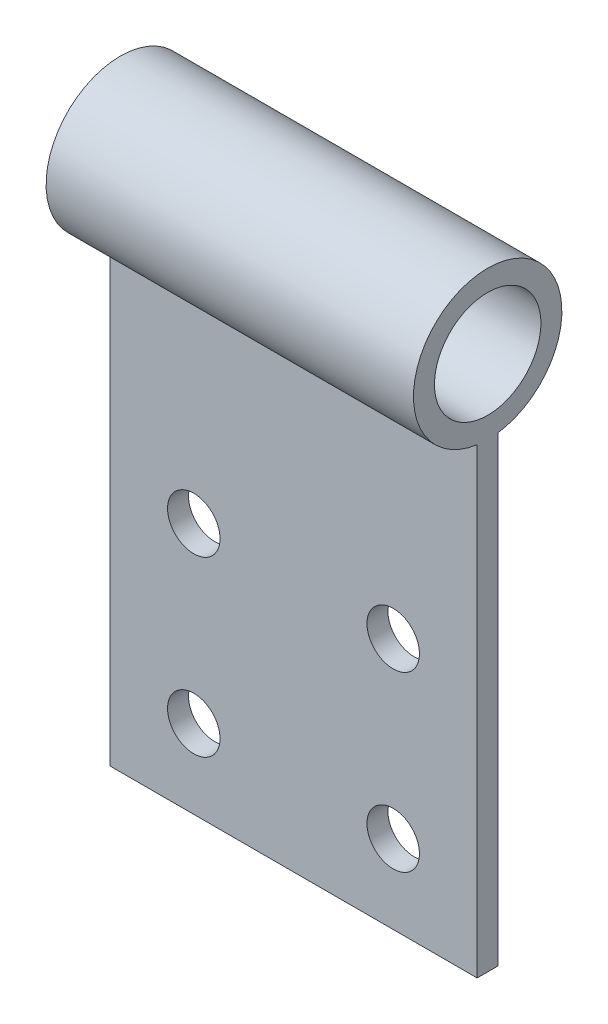
ISO-10303-21;
HEADER;
FILE_DESCRIPTION(('STEP AP214'),'2;1');
FILE_NAME('part.step','',(''),(''),'','','');
FILE_SCHEMA(('AUTOMOTIVE_DESIGN { 1 0 10303 214 1 1 1 1 }'));
ENDSEC;
DATA;
#1=APPLICATION_CONTEXT('core data for automotive mechanical design processes');
#2=APPLICATION_PROTOCOL_DEFINITION('international standard','automotive_design',2000,#1);
#3=PRODUCT_CONTEXT('',#1,'mechanical');
#4=PRODUCT('Part','Part','',(#3));
#5=PRODUCT_RELATED_PRODUCT_CATEGORY('part','',(#4));
#6=PRODUCT_DEFINITION_FORMATION('','',#4);
#7=PRODUCT_DEFINITION_CONTEXT('part definition',#1,'design');
#8=PRODUCT_DEFINITION('design','',#6,#7);
#9=PRODUCT_DEFINITION_SHAPE('','',#8);
#10=(LENGTH_UNIT() NAMED_UNIT(*) SI_UNIT(.MILLI.,.METRE.));
#11=(NAMED_UNIT(*) PLANE_ANGLE_UNIT() SI_UNIT($,.RADIAN.));
#12=(NAMED_UNIT(*) SI_UNIT($,.STERADIAN.) SOLID_ANGLE_UNIT());
#13=UNCERTAINTY_MEASURE_WITH_UNIT(LENGTH_MEASURE(1.E-05),#10,'distance_accuracy_value','');
#14=(GEOMETRIC_REPRESENTATION_CONTEXT(3) GLOBAL_UNCERTAINTY_ASSIGNED_CONTEXT((#13)) GLOBAL_UNIT_ASSIGNED_CONTEXT((#10,
#11,#12)) REPRESENTATION_CONTEXT('',''));
#15=CARTESIAN_POINT('',(0.,0.,0.));
#16=DIRECTION('',(0.,0.,1.));
#17=DIRECTION('',(1.,0.,0.));
#18=AXIS2_PLACEMENT_3D('',#15,#16,#17);
#19=CARTESIAN_POINT('',(0.,0.,2.));
#20=DIRECTION('',(1.,0.,0.));
#21=DIRECTION('',(0.,0.,-1.));
#22=AXIS2_PLACEMENT_3D('',#19,#20,#21);
#23=PLANE('',#22);
#24=DIRECTION('',(0.,-1.,0.));
#25=VECTOR('',#24,1.);
#26=CARTESIAN_POINT('',(0.,0.,0.));
#27=LINE('',#26,#25);
#28=CARTESIAN_POINT('',(0.,44.,0.));
#29=VERTEX_POINT('',#28);
#30=CARTESIAN_POINT('',(0.,0.,0.));
#31=VERTEX_POINT('',#30);
#32=EDGE_CURVE('E128',#29,#31,#27,.T.);
#33=ORIENTED_EDGE('',*,*,#32,.T.);
#34=DIRECTION('',(0.,0.,-1.));
#35=VECTOR('',#34,1.);
#36=CARTESIAN_POINT('',(0.,0.,2.));
#37=LINE('',#36,#35);
#38=CARTESIAN_POINT('',(0.,0.,2.));
#39=VERTEX_POINT('',#38);
#40=EDGE_CURVE('E11',#39,#31,#37,.T.);
#41=ORIENTED_EDGE('',*,*,#40,.F.);
#42=DIRECTION('',(0.,-1.,0.));
#43=VECTOR('',#42,1.);
#44=CARTESIAN_POINT('',(0.,0.,2.));
#45=LINE('',#44,#43);
#46=CARTESIAN_POINT('',(0.,44.,2.));
#47=VERTEX_POINT('',#46);
#48=EDGE_CURVE('E77',#47,#39,#45,.T.);
#49=ORIENTED_EDGE('',*,*,#48,.F.);
#50=CARTESIAN_POINT('',(0.,51.,1.));
#51=DIRECTION('',(-1.,0.,0.));
#52=DIRECTION('',(0.,0.,-1.));
#53=AXIS2_PLACEMENT_3D('',#50,#51,#52);
#54=CIRCLE('',#53,7.07106781186547);
#55=EDGE_CURVE('E82',#47,#29,#54,.T.);
#56=ORIENTED_EDGE('',*,*,#55,.T.);
#57=EDGE_LOOP('',(#33,#41,#49,#56));
#58=FACE_BOUND('',#57,.T.);
#59=CARTESIAN_POINT('',(0.,51.,1.));
#60=DIRECTION('',(-1.,0.,0.));
#61=DIRECTION('',(0.,0.,1.));
#62=AXIS2_PLACEMENT_3D('',#59,#60,#61);
#63=CIRCLE('',#62,5.07106781186548);
#64=CARTESIAN_POINT('',(0.,51.,6.07106781186548));
#65=VERTEX_POINT('',#64);
#66=EDGE_CURVE('E95',#65,#65,#63,.T.);
#67=ORIENTED_EDGE('',*,*,#66,.F.);
#68=EDGE_LOOP('',(#67));
#69=FACE_BOUND('',#68,.T.);
#70=ADVANCED_FACE('F33',(#58,#69),#23,.F.);
#71=CARTESIAN_POINT('',(0.,0.,2.));
#72=DIRECTION('',(0.,1.,0.));
#73=DIRECTION('',(0.,0.,1.));
#74=AXIS2_PLACEMENT_3D('',#71,#72,#73);
#75=PLANE('',#74);
#76=DIRECTION('',(1.,0.,0.));
#77=VECTOR('',#76,1.);
#78=CARTESIAN_POINT('',(0.,0.,0.));
#79=LINE('',#78,#77);
#80=CARTESIAN_POINT('',(35.,0.,0.));
#81=VERTEX_POINT('',#80);
#82=EDGE_CURVE('E60',#31,#81,#79,.T.);
#83=ORIENTED_EDGE('',*,*,#82,.T.);
#84=DIRECTION('',(0.,0.,-1.));
#85=VECTOR('',#84,1.);
#86=CARTESIAN_POINT('',(35.,0.,2.));
#87=LINE('',#86,#85);
#88=CARTESIAN_POINT('',(35.,0.,2.));
#89=VERTEX_POINT('',#88);
#90=EDGE_CURVE('E41',#89,#81,#87,.T.);
#91=ORIENTED_EDGE('',*,*,#90,.F.);
#92=DIRECTION('',(1.,0.,0.));
#93=VECTOR('',#92,1.);
#94=CARTESIAN_POINT('',(0.,0.,2.));
#95=LINE('',#94,#93);
#96=EDGE_CURVE('E49',#39,#89,#95,.T.);
#97=ORIENTED_EDGE('',*,*,#96,.F.);
#98=ORIENTED_EDGE('',*,*,#40,.T.);
#99=EDGE_LOOP('',(#83,#91,#97,#98));
#100=FACE_BOUND('',#99,.T.);
#101=ADVANCED_FACE('F156',(#100),#75,.F.);
#102=CARTESIAN_POINT('',(35.,0.,2.));
#103=DIRECTION('',(-1.,0.,0.));
#104=DIRECTION('',(0.,0.,1.));
#105=AXIS2_PLACEMENT_3D('',#102,#103,#104);
#106=PLANE('',#105);
#107=DIRECTION('',(0.,1.,0.));
#108=VECTOR('',#107,1.);
#109=CARTESIAN_POINT('',(35.,0.,0.));
#110=LINE('',#109,#108);
#111=CARTESIAN_POINT('',(35.,44.,0.));
#112=VERTEX_POINT('',#111);
#113=EDGE_CURVE('E67',#81,#112,#110,.T.);
#114=ORIENTED_EDGE('',*,*,#113,.T.);
#115=CARTESIAN_POINT('',(35.,51.,1.));
#116=DIRECTION('',(-1.,0.,0.));
#117=DIRECTION('',(0.,0.,1.));
#118=AXIS2_PLACEMENT_3D('',#115,#116,#117);
#119=CIRCLE('',#118,7.07106781186547);
#120=CARTESIAN_POINT('',(35.,44.,2.));
#121=VERTEX_POINT('',#120);
#122=EDGE_CURVE('E101',#112,#121,#119,.F.);
#123=ORIENTED_EDGE('',*,*,#122,.T.);
#124=DIRECTION('',(0.,1.,0.));
#125=VECTOR('',#124,1.);
#126=CARTESIAN_POINT('',(35.,0.,2.));
#127=LINE('',#126,#125);
#128=EDGE_CURVE('E88',#89,#121,#127,.T.);
#129=ORIENTED_EDGE('',*,*,#128,.F.);
#130=ORIENTED_EDGE('',*,*,#90,.T.);
#131=EDGE_LOOP('',(#114,#123,#129,#130));
#132=FACE_BOUND('',#131,.T.);
#133=CARTESIAN_POINT('',(35.,51.,1.));
#134=DIRECTION('',(-1.,0.,0.));
#135=DIRECTION('',(0.,0.,1.));
#136=AXIS2_PLACEMENT_3D('',#133,#134,#135);
#137=CIRCLE('',#136,5.07106781186548);
#138=CARTESIAN_POINT('',(35.,51.,6.07106781186548));
#139=VERTEX_POINT('',#138);
#140=EDGE_CURVE('E103',#139,#139,#137,.F.);
#141=ORIENTED_EDGE('',*,*,#140,.F.);
#142=EDGE_LOOP('',(#141));
#143=FACE_BOUND('',#142,.T.);
#144=ADVANCED_FACE('F135',(#132,#143),#106,.F.);
#145=CARTESIAN_POINT('',(0.,0.,2.));
#146=DIRECTION('',(0.,0.,-1.));
#147=DIRECTION('',(-1.,0.,0.));
#148=AXIS2_PLACEMENT_3D('',#145,#146,#147);
#149=PLANE('',#148);
#150=CARTESIAN_POINT('',(27.,7.49999999999999,2.));
#151=DIRECTION('',(0.,0.,-1.));
#152=DIRECTION('',(-1.,0.,0.));
#153=AXIS2_PLACEMENT_3D('',#150,#151,#152);
#154=CIRCLE('',#153,2.5);
#155=CARTESIAN_POINT('',(24.5,7.49999999999999,2.));
#156=VERTEX_POINT('',#155);
#157=EDGE_CURVE('E107',#156,#156,#154,.T.);
#158=ORIENTED_EDGE('',*,*,#157,.T.);
#159=EDGE_LOOP('',(#158));
#160=FACE_BOUND('',#159,.T.);
#161=CARTESIAN_POINT('',(8.,7.49999999999999,2.));
#162=DIRECTION('',(0.,0.,-1.));
#163=DIRECTION('',(-1.,0.,0.));
#164=AXIS2_PLACEMENT_3D('',#161,#162,#163);
#165=CIRCLE('',#164,2.5);
#166=CARTESIAN_POINT('',(5.5,7.49999999999999,2.));
#167=VERTEX_POINT('',#166);
#168=EDGE_CURVE('E113',#167,#167,#165,.T.);
#169=ORIENTED_EDGE('',*,*,#168,.T.);
#170=EDGE_LOOP('',(#169));
#171=FACE_BOUND('',#170,.T.);
#172=CARTESIAN_POINT('',(8.00000000000001,24.,2.));
#173=DIRECTION('',(0.,0.,-1.));
#174=DIRECTION('',(-1.,0.,0.));
#175=AXIS2_PLACEMENT_3D('',#172,#173,#174);
#176=CIRCLE('',#175,2.5);
#177=CARTESIAN_POINT('',(5.50000000000001,24.,2.));
#178=VERTEX_POINT('',#177);
#179=EDGE_CURVE('E119',#178,#178,#176,.T.);
#180=ORIENTED_EDGE('',*,*,#179,.T.);
#181=EDGE_LOOP('',(#180));
#182=FACE_BOUND('',#181,.T.);
#183=CARTESIAN_POINT('',(27.,24.,2.));
#184=DIRECTION('',(0.,0.,-1.));
#185=DIRECTION('',(-1.,0.,0.));
#186=AXIS2_PLACEMENT_3D('',#183,#184,#185);
#187=CIRCLE('',#186,2.5);
#188=CARTESIAN_POINT('',(24.5,24.,2.));
#189=VERTEX_POINT('',#188);
#190=EDGE_CURVE('E125',#189,#189,#187,.T.);
#191=ORIENTED_EDGE('',*,*,#190,.T.);
#192=EDGE_LOOP('',(#191));
#193=FACE_BOUND('',#192,.T.);
#194=ORIENTED_EDGE('',*,*,#48,.T.);
#195=ORIENTED_EDGE('',*,*,#96,.T.);
#196=ORIENTED_EDGE('',*,*,#128,.T.);
#197=DIRECTION('',(-1.,0.,0.));
#198=VECTOR('',#197,1.);
#199=CARTESIAN_POINT('',(57.9469713003926,44.,2.));
#200=LINE('',#199,#198);
#201=EDGE_CURVE('E85',#121,#47,#200,.T.);
#202=ORIENTED_EDGE('',*,*,#201,.T.);
#203=EDGE_LOOP('',(#194,#195,#196,#202));
#204=FACE_BOUND('',#203,.T.);
#205=ADVANCED_FACE('F86',(#160,#171,#182,#193,#204),#149,.F.);
#206=CARTESIAN_POINT('',(0.,0.,0.));
#207=DIRECTION('',(0.,0.,-1.));
#208=DIRECTION('',(-1.,0.,0.));
#209=AXIS2_PLACEMENT_3D('',#206,#207,#208);
#210=PLANE('',#209);
#211=CARTESIAN_POINT('',(27.,7.49999999999999,0.));
#212=DIRECTION('',(0.,0.,-1.));
#213=DIRECTION('',(-1.,0.,0.));
#214=AXIS2_PLACEMENT_3D('',#211,#212,#213);
#215=CIRCLE('',#214,2.5);
#216=CARTESIAN_POINT('',(24.5,7.49999999999999,0.));
#217=VERTEX_POINT('',#216);
#218=EDGE_CURVE('E106',#217,#217,#215,.T.);
#219=ORIENTED_EDGE('',*,*,#218,.F.);
#220=EDGE_LOOP('',(#219));
#221=FACE_BOUND('',#220,.T.);
#222=CARTESIAN_POINT('',(8.,7.49999999999999,0.));
#223=DIRECTION('',(0.,0.,-1.));
#224=DIRECTION('',(-1.,0.,0.));
#225=AXIS2_PLACEMENT_3D('',#222,#223,#224);
#226=CIRCLE('',#225,2.5);
#227=CARTESIAN_POINT('',(5.5,7.49999999999999,0.));
#228=VERTEX_POINT('',#227);
#229=EDGE_CURVE('E110',#228,#228,#226,.T.);
#230=ORIENTED_EDGE('',*,*,#229,.F.);
#231=EDGE_LOOP('',(#230));
#232=FACE_BOUND('',#231,.T.);
#233=CARTESIAN_POINT('',(8.00000000000001,24.,0.));
#234=DIRECTION('',(0.,0.,-1.));
#235=DIRECTION('',(-1.,0.,0.));
#236=AXIS2_PLACEMENT_3D('',#233,#234,#235);
#237=CIRCLE('',#236,2.5);
#238=CARTESIAN_POINT('',(5.50000000000001,24.,0.));
#239=VERTEX_POINT('',#238);
#240=EDGE_CURVE('E116',#239,#239,#237,.T.);
#241=ORIENTED_EDGE('',*,*,#240,.F.);
#242=EDGE_LOOP('',(#241));
#243=FACE_BOUND('',#242,.T.);
#244=CARTESIAN_POINT('',(27.,24.,0.));
#245=DIRECTION('',(0.,0.,-1.));
#246=DIRECTION('',(-1.,0.,0.));
#247=AXIS2_PLACEMENT_3D('',#244,#245,#246);
#248=CIRCLE('',#247,2.5);
#249=CARTESIAN_POINT('',(24.5,24.,0.));
#250=VERTEX_POINT('',#249);
#251=EDGE_CURVE('E122',#250,#250,#248,.T.);
#252=ORIENTED_EDGE('',*,*,#251,.F.);
#253=EDGE_LOOP('',(#252));
#254=FACE_BOUND('',#253,.T.);
#255=ORIENTED_EDGE('',*,*,#32,.F.);
#256=DIRECTION('',(-1.,0.,0.));
#257=VECTOR('',#256,1.);
#258=CARTESIAN_POINT('',(57.9469713003926,44.,0.));
#259=LINE('',#258,#257);
#260=EDGE_CURVE('E90',#112,#29,#259,.T.);
#261=ORIENTED_EDGE('',*,*,#260,.F.);
#262=ORIENTED_EDGE('',*,*,#113,.F.);
#263=ORIENTED_EDGE('',*,*,#82,.F.);
#264=EDGE_LOOP('',(#255,#261,#262,#263));
#265=FACE_BOUND('',#264,.T.);
#266=ADVANCED_FACE('F138',(#221,#232,#243,#254,#265),#210,.T.);
#267=CARTESIAN_POINT('',(27.,24.,2.));
#268=DIRECTION('',(0.,0.,-1.));
#269=DIRECTION('',(-1.,0.,0.));
#270=AXIS2_PLACEMENT_3D('',#267,#268,#269);
#271=CYLINDRICAL_SURFACE('',#270,2.5);
#272=ORIENTED_EDGE('',*,*,#190,.F.);
#273=EDGE_LOOP('',(#272));
#274=FACE_BOUND('',#273,.T.);
#275=ORIENTED_EDGE('',*,*,#251,.T.);
#276=EDGE_LOOP('',(#275));
#277=FACE_BOUND('',#276,.T.);
#278=ADVANCED_FACE('F140',(#274,#277),#271,.F.);
#279=CARTESIAN_POINT('',(8.00000000000001,24.,2.));
#280=DIRECTION('',(0.,0.,-1.));
#281=DIRECTION('',(-1.,0.,0.));
#282=AXIS2_PLACEMENT_3D('',#279,#280,#281);
#283=CYLINDRICAL_SURFACE('',#282,2.5);
#284=ORIENTED_EDGE('',*,*,#179,.F.);
#285=EDGE_LOOP('',(#284));
#286=FACE_BOUND('',#285,.T.);
#287=ORIENTED_EDGE('',*,*,#240,.T.);
#288=EDGE_LOOP('',(#287));
#289=FACE_BOUND('',#288,.T.);
#290=ADVANCED_FACE('F147',(#286,#289),#283,.F.);
#291=CARTESIAN_POINT('',(8.,7.49999999999999,2.));
#292=DIRECTION('',(0.,0.,-1.));
#293=DIRECTION('',(-1.,0.,0.));
#294=AXIS2_PLACEMENT_3D('',#291,#292,#293);
#295=CYLINDRICAL_SURFACE('',#294,2.5);
#296=ORIENTED_EDGE('',*,*,#168,.F.);
#297=EDGE_LOOP('',(#296));
#298=FACE_BOUND('',#297,.T.);
#299=ORIENTED_EDGE('',*,*,#229,.T.);
#300=EDGE_LOOP('',(#299));
#301=FACE_BOUND('',#300,.T.);
#302=ADVANCED_FACE('F202',(#298,#301),#295,.F.);
#303=CARTESIAN_POINT('',(27.,7.49999999999999,2.));
#304=DIRECTION('',(0.,0.,-1.));
#305=DIRECTION('',(-1.,0.,0.));
#306=AXIS2_PLACEMENT_3D('',#303,#304,#305);
#307=CYLINDRICAL_SURFACE('',#306,2.5);
#308=ORIENTED_EDGE('',*,*,#157,.F.);
#309=EDGE_LOOP('',(#308));
#310=FACE_BOUND('',#309,.T.);
#311=ORIENTED_EDGE('',*,*,#218,.T.);
#312=EDGE_LOOP('',(#311));
#313=FACE_BOUND('',#312,.T.);
#314=ADVANCED_FACE('F185',(#310,#313),#307,.F.);
#315=CARTESIAN_POINT('',(57.9469713003926,51.,1.));
#316=DIRECTION('',(-1.,0.,0.));
#317=DIRECTION('',(0.,0.,1.));
#318=AXIS2_PLACEMENT_3D('',#315,#316,#317);
#319=CYLINDRICAL_SURFACE('',#318,7.07106781186547);
#320=ORIENTED_EDGE('',*,*,#122,.F.);
#321=ORIENTED_EDGE('',*,*,#260,.T.);
#322=ORIENTED_EDGE('',*,*,#55,.F.);
#323=ORIENTED_EDGE('',*,*,#201,.F.);
#324=EDGE_LOOP('',(#320,#321,#322,#323));
#325=FACE_BOUND('',#324,.T.);
#326=ADVANCED_FACE('F93',(#325),#319,.T.);
#327=CARTESIAN_POINT('',(57.9469713003926,51.,1.));
#328=DIRECTION('',(-1.,0.,0.));
#329=DIRECTION('',(0.,0.,1.));
#330=AXIS2_PLACEMENT_3D('',#327,#328,#329);
#331=CYLINDRICAL_SURFACE('',#330,5.07106781186548);
#332=ORIENTED_EDGE('',*,*,#140,.T.);
#333=EDGE_LOOP('',(#332));
#334=FACE_BOUND('',#333,.T.);
#335=ORIENTED_EDGE('',*,*,#66,.T.);
#336=EDGE_LOOP('',(#335));
#337=FACE_BOUND('',#336,.T.);
#338=ADVANCED_FACE('F184',(#334,#337),#331,.F.);
#339=CLOSED_SHELL('',(#70,#101,#144,#205,#266,#278,#290,#302,#314,#326,#338));
#340=MANIFOLD_SOLID_BREP('B2',#339);
#341=ADVANCED_BREP_SHAPE_REPRESENTATION('',(#18,#340),#14);
#342=SHAPE_DEFINITION_REPRESENTATION(#9,#341);
ENDSEC;
END-ISO-10303-21;
